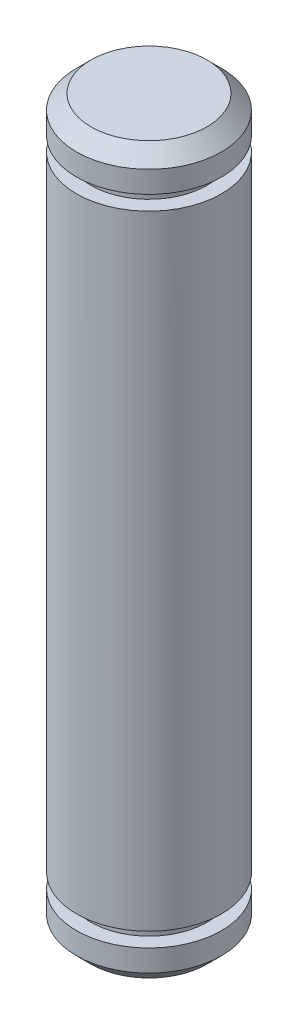
ISO-10303-21;
HEADER;
FILE_DESCRIPTION(('STEP AP214'),'2;1');
FILE_NAME('part.step','',(''),(''),'','','');
FILE_SCHEMA(('AUTOMOTIVE_DESIGN { 1 0 10303 214 1 1 1 1 }'));
ENDSEC;
DATA;
#1=APPLICATION_CONTEXT('core data for automotive mechanical design processes');
#2=APPLICATION_PROTOCOL_DEFINITION('international standard','automotive_design',2000,#1);
#3=PRODUCT_CONTEXT('',#1,'mechanical');
#4=PRODUCT('Part','Part','',(#3));
#5=PRODUCT_RELATED_PRODUCT_CATEGORY('part','',(#4));
#6=PRODUCT_DEFINITION_FORMATION('','',#4);
#7=PRODUCT_DEFINITION_CONTEXT('part definition',#1,'design');
#8=PRODUCT_DEFINITION('design','',#6,#7);
#9=PRODUCT_DEFINITION_SHAPE('','',#8);
#10=(LENGTH_UNIT() NAMED_UNIT(*) SI_UNIT(.MILLI.,.METRE.));
#11=(NAMED_UNIT(*) PLANE_ANGLE_UNIT() SI_UNIT($,.RADIAN.));
#12=(NAMED_UNIT(*) SI_UNIT($,.STERADIAN.) SOLID_ANGLE_UNIT());
#13=UNCERTAINTY_MEASURE_WITH_UNIT(LENGTH_MEASURE(1.E-05),#10,'distance_accuracy_value','');
#14=(GEOMETRIC_REPRESENTATION_CONTEXT(3) GLOBAL_UNCERTAINTY_ASSIGNED_CONTEXT((#13)) GLOBAL_UNIT_ASSIGNED_CONTEXT((#10,
#11,#12)) REPRESENTATION_CONTEXT('',''));
#15=CARTESIAN_POINT('',(0.,0.,0.));
#16=DIRECTION('',(0.,0.,1.));
#17=DIRECTION('',(1.,0.,0.));
#18=AXIS2_PLACEMENT_3D('',#15,#16,#17);
#19=CARTESIAN_POINT('',(0.,50.,0.));
#20=DIRECTION('',(0.,-1.,0.));
#21=DIRECTION('',(0.,0.,-1.));
#22=AXIS2_PLACEMENT_3D('',#19,#20,#21);
#23=CYLINDRICAL_SURFACE('',#22,5.);
#24=CARTESIAN_POINT('',(0.,3.5,0.));
#25=DIRECTION('',(0.,-1.,0.));
#26=DIRECTION('',(0.,0.,-1.));
#27=AXIS2_PLACEMENT_3D('',#24,#25,#26);
#28=CIRCLE('',#27,5.);
#29=CARTESIAN_POINT('',(0.,3.5,-5.));
#30=VERTEX_POINT('',#29);
#31=EDGE_CURVE('E44',#30,#30,#28,.T.);
#32=ORIENTED_EDGE('',*,*,#31,.F.);
#33=EDGE_LOOP('',(#32));
#34=FACE_BOUND('',#33,.T.);
#35=CARTESIAN_POINT('',(0.,46.5,0.));
#36=DIRECTION('',(0.,1.,0.));
#37=DIRECTION('',(0.,0.,1.));
#38=AXIS2_PLACEMENT_3D('',#35,#36,#37);
#39=CIRCLE('',#38,5.);
#40=CARTESIAN_POINT('',(0.,46.5,5.));
#41=VERTEX_POINT('',#40);
#42=EDGE_CURVE('E75',#41,#41,#39,.T.);
#43=ORIENTED_EDGE('',*,*,#42,.F.);
#44=EDGE_LOOP('',(#43));
#45=FACE_BOUND('',#44,.T.);
#46=ADVANCED_FACE('F39',(#34,#45),#23,.T.);
#47=CARTESIAN_POINT('',(0.,3.5,0.));
#48=DIRECTION('',(0.,-1.,0.));
#49=DIRECTION('',(0.,0.,-1.));
#50=AXIS2_PLACEMENT_3D('',#47,#48,#49);
#51=PLANE('',#50);
#52=CARTESIAN_POINT('',(0.,3.5,0.));
#53=DIRECTION('',(0.,-1.,0.));
#54=DIRECTION('',(0.,0.,-1.));
#55=AXIS2_PLACEMENT_3D('',#52,#53,#54);
#56=CIRCLE('',#55,4.);
#57=CARTESIAN_POINT('',(0.,3.5,-4.));
#58=VERTEX_POINT('',#57);
#59=EDGE_CURVE('E61',#58,#58,#56,.T.);
#60=ORIENTED_EDGE('',*,*,#59,.F.);
#61=EDGE_LOOP('',(#60));
#62=FACE_BOUND('',#61,.T.);
#63=ORIENTED_EDGE('',*,*,#31,.T.);
#64=EDGE_LOOP('',(#63));
#65=FACE_BOUND('',#64,.T.);
#66=ADVANCED_FACE('F102',(#62,#65),#51,.T.);
#67=CARTESIAN_POINT('',(0.,2.5,0.));
#68=DIRECTION('',(0.,-1.,0.));
#69=DIRECTION('',(0.,0.,-1.));
#70=AXIS2_PLACEMENT_3D('',#67,#68,#69);
#71=PLANE('',#70);
#72=CARTESIAN_POINT('',(0.,2.5,0.));
#73=DIRECTION('',(0.,-1.,0.));
#74=DIRECTION('',(0.,0.,-1.));
#75=AXIS2_PLACEMENT_3D('',#72,#73,#74);
#76=CIRCLE('',#75,4.);
#77=CARTESIAN_POINT('',(0.,2.5,-4.));
#78=VERTEX_POINT('',#77);
#79=EDGE_CURVE('E69',#78,#78,#76,.T.);
#80=ORIENTED_EDGE('',*,*,#79,.T.);
#81=EDGE_LOOP('',(#80));
#82=FACE_BOUND('',#81,.T.);
#83=CARTESIAN_POINT('',(0.,2.5,0.));
#84=DIRECTION('',(0.,-1.,0.));
#85=DIRECTION('',(0.,0.,-1.));
#86=AXIS2_PLACEMENT_3D('',#83,#84,#85);
#87=CIRCLE('',#86,5.);
#88=CARTESIAN_POINT('',(0.,2.5,-5.));
#89=VERTEX_POINT('',#88);
#90=EDGE_CURVE('E58',#89,#89,#87,.T.);
#91=ORIENTED_EDGE('',*,*,#90,.F.);
#92=EDGE_LOOP('',(#91));
#93=FACE_BOUND('',#92,.T.);
#94=ADVANCED_FACE('F107',(#82,#93),#71,.F.);
#95=CARTESIAN_POINT('',(0.,3.5,0.));
#96=DIRECTION('',(0.,-1.,0.));
#97=DIRECTION('',(0.,0.,-1.));
#98=AXIS2_PLACEMENT_3D('',#95,#96,#97);
#99=CYLINDRICAL_SURFACE('',#98,4.);
#100=ORIENTED_EDGE('',*,*,#59,.T.);
#101=EDGE_LOOP('',(#100));
#102=FACE_BOUND('',#101,.T.);
#103=ORIENTED_EDGE('',*,*,#79,.F.);
#104=EDGE_LOOP('',(#103));
#105=FACE_BOUND('',#104,.T.);
#106=ADVANCED_FACE('F99',(#102,#105),#99,.T.);
#107=CARTESIAN_POINT('',(0.,0.,0.));
#108=DIRECTION('',(0.,1.,0.));
#109=DIRECTION('',(0.,0.,1.));
#110=AXIS2_PLACEMENT_3D('',#107,#108,#109);
#111=PLANE('',#110);
#112=CARTESIAN_POINT('',(0.,0.,0.));
#113=DIRECTION('',(0.,1.,0.));
#114=DIRECTION('',(0.,0.,1.));
#115=AXIS2_PLACEMENT_3D('',#112,#113,#114);
#116=CIRCLE('',#115,3.99999999999999);
#117=CARTESIAN_POINT('',(0.,0.,3.99999999999999));
#118=VERTEX_POINT('',#117);
#119=EDGE_CURVE('E10',#118,#118,#116,.F.);
#120=ORIENTED_EDGE('',*,*,#119,.T.);
#121=EDGE_LOOP('',(#120));
#122=FACE_BOUND('',#121,.T.);
#123=ADVANCED_FACE('F90',(#122),#111,.F.);
#124=CARTESIAN_POINT('',(0.,1.,0.));
#125=DIRECTION('',(0.,1.,0.));
#126=DIRECTION('',(0.,0.,1.));
#127=AXIS2_PLACEMENT_3D('',#124,#125,#126);
#128=CONICAL_SURFACE('',#127,5.,0.785398163397453);
#129=ORIENTED_EDGE('',*,*,#119,.F.);
#130=EDGE_LOOP('',(#129));
#131=FACE_BOUND('',#130,.T.);
#132=CARTESIAN_POINT('',(0.,1.,0.));
#133=DIRECTION('',(0.,1.,0.));
#134=DIRECTION('',(0.,0.,1.));
#135=AXIS2_PLACEMENT_3D('',#132,#133,#134);
#136=CIRCLE('',#135,5.);
#137=CARTESIAN_POINT('',(0.,1.,5.));
#138=VERTEX_POINT('',#137);
#139=EDGE_CURVE('E55',#138,#138,#136,.T.);
#140=ORIENTED_EDGE('',*,*,#139,.F.);
#141=EDGE_LOOP('',(#140));
#142=FACE_BOUND('',#141,.T.);
#143=ADVANCED_FACE('F42',(#131,#142),#128,.T.);
#144=ORIENTED_EDGE('',*,*,#90,.T.);
#145=EDGE_LOOP('',(#144));
#146=FACE_BOUND('',#145,.T.);
#147=ORIENTED_EDGE('',*,*,#139,.T.);
#148=EDGE_LOOP('',(#147));
#149=FACE_BOUND('',#148,.T.);
#150=ADVANCED_FACE('F87',(#146,#149),#23,.T.);
#151=CARTESIAN_POINT('',(0.,46.5,0.));
#152=DIRECTION('',(0.,1.,0.));
#153=DIRECTION('',(0.,0.,1.));
#154=AXIS2_PLACEMENT_3D('',#151,#152,#153);
#155=PLANE('',#154);
#156=CARTESIAN_POINT('',(0.,46.5,0.));
#157=DIRECTION('',(0.,1.,0.));
#158=DIRECTION('',(0.,0.,1.));
#159=AXIS2_PLACEMENT_3D('',#156,#157,#158);
#160=CIRCLE('',#159,4.);
#161=CARTESIAN_POINT('',(0.,46.5,4.));
#162=VERTEX_POINT('',#161);
#163=EDGE_CURVE('E152',#162,#162,#160,.T.);
#164=ORIENTED_EDGE('',*,*,#163,.F.);
#165=EDGE_LOOP('',(#164));
#166=FACE_BOUND('',#165,.T.);
#167=ORIENTED_EDGE('',*,*,#42,.T.);
#168=EDGE_LOOP('',(#167));
#169=FACE_BOUND('',#168,.T.);
#170=ADVANCED_FACE('F96',(#166,#169),#155,.T.);
#171=CARTESIAN_POINT('',(0.,47.5,0.));
#172=DIRECTION('',(0.,1.,0.));
#173=DIRECTION('',(0.,0.,1.));
#174=AXIS2_PLACEMENT_3D('',#171,#172,#173);
#175=PLANE('',#174);
#176=CARTESIAN_POINT('',(0.,47.5,0.));
#177=DIRECTION('',(0.,1.,0.));
#178=DIRECTION('',(0.,0.,1.));
#179=AXIS2_PLACEMENT_3D('',#176,#177,#178);
#180=CIRCLE('',#179,4.);
#181=CARTESIAN_POINT('',(0.,47.5,4.));
#182=VERTEX_POINT('',#181);
#183=EDGE_CURVE('E158',#182,#182,#180,.T.);
#184=ORIENTED_EDGE('',*,*,#183,.T.);
#185=EDGE_LOOP('',(#184));
#186=FACE_BOUND('',#185,.T.);
#187=CARTESIAN_POINT('',(0.,47.5,0.));
#188=DIRECTION('',(0.,1.,0.));
#189=DIRECTION('',(0.,0.,1.));
#190=AXIS2_PLACEMENT_3D('',#187,#188,#189);
#191=CIRCLE('',#190,5.);
#192=CARTESIAN_POINT('',(0.,47.5,5.));
#193=VERTEX_POINT('',#192);
#194=EDGE_CURVE('E78',#193,#193,#191,.T.);
#195=ORIENTED_EDGE('',*,*,#194,.F.);
#196=EDGE_LOOP('',(#195));
#197=FACE_BOUND('',#196,.T.);
#198=ADVANCED_FACE('F133',(#186,#197),#175,.F.);
#199=CARTESIAN_POINT('',(0.,46.5,0.));
#200=DIRECTION('',(0.,1.,0.));
#201=DIRECTION('',(0.,0.,1.));
#202=AXIS2_PLACEMENT_3D('',#199,#200,#201);
#203=CYLINDRICAL_SURFACE('',#202,4.);
#204=ORIENTED_EDGE('',*,*,#163,.T.);
#205=EDGE_LOOP('',(#204));
#206=FACE_BOUND('',#205,.T.);
#207=ORIENTED_EDGE('',*,*,#183,.F.);
#208=EDGE_LOOP('',(#207));
#209=FACE_BOUND('',#208,.T.);
#210=ADVANCED_FACE('F128',(#206,#209),#203,.T.);
#211=CARTESIAN_POINT('',(0.,50.,0.));
#212=DIRECTION('',(0.,1.,0.));
#213=DIRECTION('',(0.,0.,1.));
#214=AXIS2_PLACEMENT_3D('',#211,#212,#213);
#215=PLANE('',#214);
#216=CARTESIAN_POINT('',(0.,50.,0.));
#217=DIRECTION('',(0.,1.,0.));
#218=DIRECTION('',(0.,0.,1.));
#219=AXIS2_PLACEMENT_3D('',#216,#217,#218);
#220=CIRCLE('',#219,3.99999999999999);
#221=CARTESIAN_POINT('',(0.,50.,3.99999999999999));
#222=VERTEX_POINT('',#221);
#223=EDGE_CURVE('E67',#222,#222,#220,.T.);
#224=ORIENTED_EDGE('',*,*,#223,.T.);
#225=EDGE_LOOP('',(#224));
#226=FACE_BOUND('',#225,.T.);
#227=ADVANCED_FACE('F118',(#226),#215,.T.);
#228=CARTESIAN_POINT('',(0.,50.,0.));
#229=DIRECTION('',(0.,-1.,0.));
#230=DIRECTION('',(0.,0.,-1.));
#231=AXIS2_PLACEMENT_3D('',#228,#229,#230);
#232=CONICAL_SURFACE('',#231,3.99999999999999,0.785398163397446);
#233=CARTESIAN_POINT('',(0.,49.,0.));
#234=DIRECTION('',(0.,1.,0.));
#235=DIRECTION('',(0.,0.,1.));
#236=AXIS2_PLACEMENT_3D('',#233,#234,#235);
#237=CIRCLE('',#236,5.);
#238=CARTESIAN_POINT('',(0.,49.,5.));
#239=VERTEX_POINT('',#238);
#240=EDGE_CURVE('E49',#239,#239,#237,.F.);
#241=ORIENTED_EDGE('',*,*,#240,.F.);
#242=EDGE_LOOP('',(#241));
#243=FACE_BOUND('',#242,.T.);
#244=ORIENTED_EDGE('',*,*,#223,.F.);
#245=EDGE_LOOP('',(#244));
#246=FACE_BOUND('',#245,.T.);
#247=ADVANCED_FACE('F113',(#243,#246),#232,.T.);
#248=ORIENTED_EDGE('',*,*,#194,.T.);
#249=EDGE_LOOP('',(#248));
#250=FACE_BOUND('',#249,.T.);
#251=ORIENTED_EDGE('',*,*,#240,.T.);
#252=EDGE_LOOP('',(#251));
#253=FACE_BOUND('',#252,.T.);
#254=ADVANCED_FACE('F98',(#250,#253),#23,.T.);
#255=CLOSED_SHELL('',(#46,#66,#94,#106,#123,#143,#150,#170,#198,#210,#227,#247,#254));
#256=MANIFOLD_SOLID_BREP('B2',#255);
#257=ADVANCED_BREP_SHAPE_REPRESENTATION('',(#18,#256),#14);
#258=SHAPE_DEFINITION_REPRESENTATION(#9,#257);
ENDSEC;
END-ISO-10303-21;
